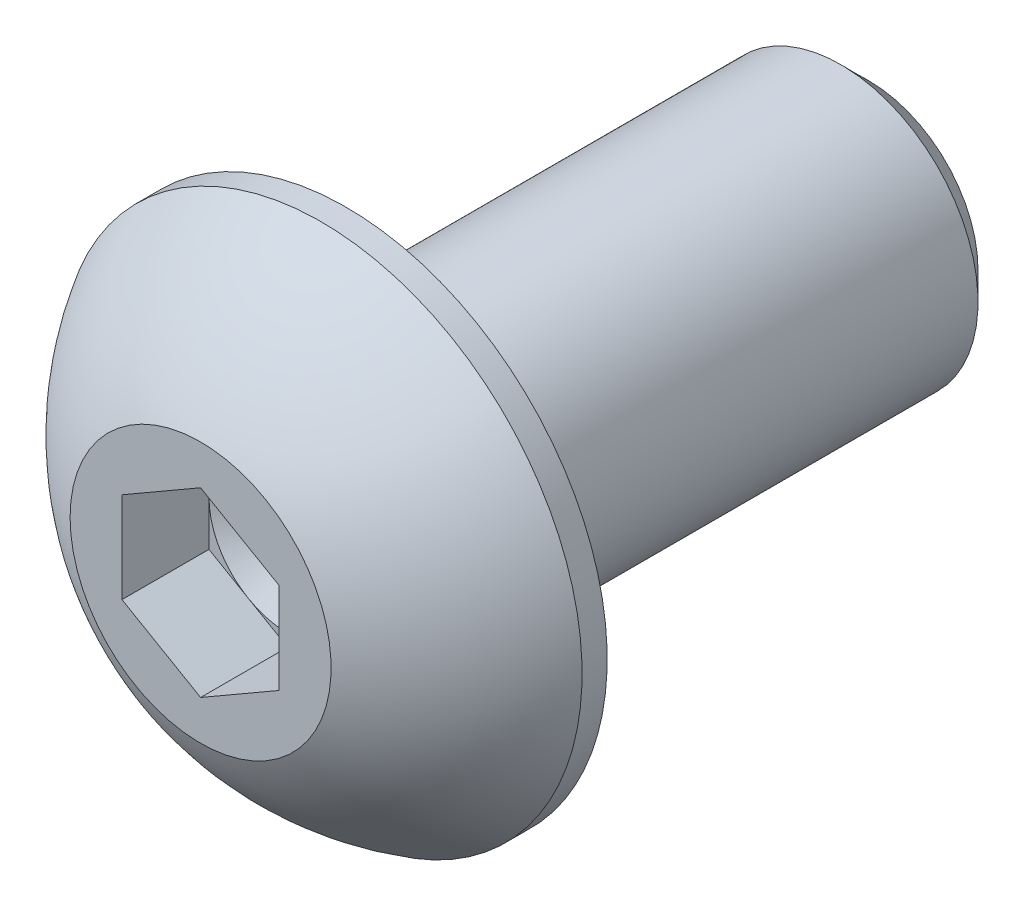
ISO-10303-21;
HEADER;
FILE_DESCRIPTION(('STEP AP214'),'2;1');
FILE_NAME('part.step','',(''),(''),'','','');
FILE_SCHEMA(('AUTOMOTIVE_DESIGN { 1 0 10303 214 1 1 1 1 }'));
ENDSEC;
DATA;
#1=APPLICATION_CONTEXT('core data for automotive mechanical design processes');
#2=APPLICATION_PROTOCOL_DEFINITION('international standard','automotive_design',2000,#1);
#3=PRODUCT_CONTEXT('',#1,'mechanical');
#4=PRODUCT('Part','Part','',(#3));
#5=PRODUCT_RELATED_PRODUCT_CATEGORY('part','',(#4));
#6=PRODUCT_DEFINITION_FORMATION('','',#4);
#7=PRODUCT_DEFINITION_CONTEXT('part definition',#1,'design');
#8=PRODUCT_DEFINITION('design','',#6,#7);
#9=PRODUCT_DEFINITION_SHAPE('','',#8);
#10=(LENGTH_UNIT() NAMED_UNIT(*) SI_UNIT(.MILLI.,.METRE.));
#11=(NAMED_UNIT(*) PLANE_ANGLE_UNIT() SI_UNIT($,.RADIAN.));
#12=(NAMED_UNIT(*) SI_UNIT($,.STERADIAN.) SOLID_ANGLE_UNIT());
#13=UNCERTAINTY_MEASURE_WITH_UNIT(LENGTH_MEASURE(1.E-05),#10,'distance_accuracy_value','');
#14=(GEOMETRIC_REPRESENTATION_CONTEXT(3) GLOBAL_UNCERTAINTY_ASSIGNED_CONTEXT((#13)) GLOBAL_UNIT_ASSIGNED_CONTEXT((#10,
#11,#12)) REPRESENTATION_CONTEXT('',''));
#15=CARTESIAN_POINT('',(0.,0.,0.));
#16=DIRECTION('',(0.,0.,1.));
#17=DIRECTION('',(1.,0.,0.));
#18=AXIS2_PLACEMENT_3D('',#15,#16,#17);
#19=CARTESIAN_POINT('',(0.,0.,-1.3208));
#20=DIRECTION('',(0.,0.,1.));
#21=DIRECTION('',(1.,0.,0.));
#22=AXIS2_PLACEMENT_3D('',#19,#20,#21);
#23=PLANE('',#22);
#24=CARTESIAN_POINT('',(0.,0.,-1.3208));
#25=DIRECTION('',(0.,0.,1.));
#26=DIRECTION('',(1.,0.,0.));
#27=AXIS2_PLACEMENT_3D('',#24,#25,#26);
#28=CIRCLE('',#27,1.1938);
#29=CARTESIAN_POINT('',(1.1938,0.,-1.3208));
#30=VERTEX_POINT('',#29);
#31=CARTESIAN_POINT('',(0.5969,1.03386112703786,-1.3208));
#32=VERTEX_POINT('',#31);
#33=EDGE_CURVE('E95',#30,#32,#28,.T.);
#34=ORIENTED_EDGE('',*,*,#33,.F.);
#35=DIRECTION('',(0.,-1.,0.));
#36=VECTOR('',#35,1.);
#37=CARTESIAN_POINT('',(1.1938,0.,-1.3208));
#38=LINE('',#37,#36);
#39=CARTESIAN_POINT('',(1.1938,0.689240751358576,-1.3208));
#40=VERTEX_POINT('',#39);
#41=EDGE_CURVE('E117',#40,#30,#38,.T.);
#42=ORIENTED_EDGE('',*,*,#41,.F.);
#43=DIRECTION('',(0.866025403784438,-0.5,0.));
#44=VECTOR('',#43,1.);
#45=CARTESIAN_POINT('',(0.5969,1.03386112703786,-1.3208));
#46=LINE('',#45,#44);
#47=EDGE_CURVE('E115',#32,#40,#46,.T.);
#48=ORIENTED_EDGE('',*,*,#47,.F.);
#49=EDGE_LOOP('',(#34,#42,#48));
#50=FACE_BOUND('',#49,.T.);
#51=ADVANCED_FACE('F17',(#50),#23,.T.);
#52=CARTESIAN_POINT('',(-0.5969,1.03386112703786,-1.3208));
#53=VERTEX_POINT('',#52);
#54=EDGE_CURVE('E97',#32,#53,#28,.T.);
#55=ORIENTED_EDGE('',*,*,#54,.F.);
#56=CARTESIAN_POINT('',(0.,1.37848150271715,-1.3208));
#57=VERTEX_POINT('',#56);
#58=EDGE_CURVE('E111',#57,#32,#46,.T.);
#59=ORIENTED_EDGE('',*,*,#58,.F.);
#60=DIRECTION('',(0.866025403784437,0.5,0.));
#61=VECTOR('',#60,1.);
#62=CARTESIAN_POINT('',(-0.5969,1.03386112703786,-1.3208));
#63=LINE('',#62,#61);
#64=EDGE_CURVE('E112',#53,#57,#63,.T.);
#65=ORIENTED_EDGE('',*,*,#64,.F.);
#66=EDGE_LOOP('',(#55,#59,#65));
#67=FACE_BOUND('',#66,.T.);
#68=ADVANCED_FACE('F109',(#67),#23,.T.);
#69=CARTESIAN_POINT('',(-1.1938,0.,-1.3208));
#70=VERTEX_POINT('',#69);
#71=EDGE_CURVE('E114',#53,#70,#28,.T.);
#72=ORIENTED_EDGE('',*,*,#71,.F.);
#73=CARTESIAN_POINT('',(-1.1938,0.689240751358572,-1.3208));
#74=VERTEX_POINT('',#73);
#75=EDGE_CURVE('E126',#74,#53,#63,.T.);
#76=ORIENTED_EDGE('',*,*,#75,.F.);
#77=DIRECTION('',(0.,1.,0.));
#78=VECTOR('',#77,1.);
#79=CARTESIAN_POINT('',(-1.1938,0.,-1.3208));
#80=LINE('',#79,#78);
#81=EDGE_CURVE('E129',#70,#74,#80,.T.);
#82=ORIENTED_EDGE('',*,*,#81,.F.);
#83=EDGE_LOOP('',(#72,#76,#82));
#84=FACE_BOUND('',#83,.T.);
#85=ADVANCED_FACE('F198',(#84),#23,.T.);
#86=CARTESIAN_POINT('',(-0.5969,-1.03386112703786,-1.3208));
#87=VERTEX_POINT('',#86);
#88=EDGE_CURVE('E224',#70,#87,#28,.T.);
#89=ORIENTED_EDGE('',*,*,#88,.F.);
#90=CARTESIAN_POINT('',(-1.1938,-0.689240751358575,-1.3208));
#91=VERTEX_POINT('',#90);
#92=EDGE_CURVE('E130',#91,#70,#80,.T.);
#93=ORIENTED_EDGE('',*,*,#92,.F.);
#94=DIRECTION('',(-0.866025403784438,0.5,0.));
#95=VECTOR('',#94,1.);
#96=CARTESIAN_POINT('',(-0.5969,-1.03386112703786,-1.3208));
#97=LINE('',#96,#95);
#98=EDGE_CURVE('E133',#87,#91,#97,.T.);
#99=ORIENTED_EDGE('',*,*,#98,.F.);
#100=EDGE_LOOP('',(#89,#93,#99));
#101=FACE_BOUND('',#100,.T.);
#102=ADVANCED_FACE('F211',(#101),#23,.T.);
#103=CARTESIAN_POINT('',(0.5969,-1.03386112703786,-1.3208));
#104=VERTEX_POINT('',#103);
#105=EDGE_CURVE('E32',#87,#104,#28,.T.);
#106=ORIENTED_EDGE('',*,*,#105,.F.);
#107=CARTESIAN_POINT('',(0.,-1.37848150271715,-1.3208));
#108=VERTEX_POINT('',#107);
#109=EDGE_CURVE('E134',#108,#87,#97,.T.);
#110=ORIENTED_EDGE('',*,*,#109,.F.);
#111=DIRECTION('',(-0.866025403784437,-0.5,0.));
#112=VECTOR('',#111,1.);
#113=CARTESIAN_POINT('',(0.5969,-1.03386112703786,-1.3208));
#114=LINE('',#113,#112);
#115=EDGE_CURVE('E137',#104,#108,#114,.T.);
#116=ORIENTED_EDGE('',*,*,#115,.F.);
#117=EDGE_LOOP('',(#106,#110,#116));
#118=FACE_BOUND('',#117,.T.);
#119=ADVANCED_FACE('F203',(#118),#23,.T.);
#120=CARTESIAN_POINT('',(-0.9906,0.,0.));
#121=DIRECTION('',(0.,0.,1.));
#122=DIRECTION('',(1.,0.,0.));
#123=AXIS2_PLACEMENT_3D('',#120,#121,#122);
#124=PLANE('',#123);
#125=CARTESIAN_POINT('',(0.,0.,0.));
#126=DIRECTION('',(0.,0.,-1.));
#127=DIRECTION('',(-1.,0.,0.));
#128=AXIS2_PLACEMENT_3D('',#125,#126,#127);
#129=CIRCLE('',#128,1.9812);
#130=CARTESIAN_POINT('',(-1.9812,0.,0.));
#131=VERTEX_POINT('',#130);
#132=EDGE_CURVE('E171',#131,#131,#129,.T.);
#133=ORIENTED_EDGE('',*,*,#132,.F.);
#134=EDGE_LOOP('',(#133));
#135=FACE_BOUND('',#134,.T.);
#136=DIRECTION('',(0.866025403784437,0.5,0.));
#137=VECTOR('',#136,1.);
#138=CARTESIAN_POINT('',(-0.5969,1.03386112703786,0.));
#139=LINE('',#138,#137);
#140=CARTESIAN_POINT('',(-1.1938,0.689240751358572,0.));
#141=VERTEX_POINT('',#140);
#142=CARTESIAN_POINT('',(0.,1.37848150271715,0.));
#143=VERTEX_POINT('',#142);
#144=EDGE_CURVE('E146',#141,#143,#139,.T.);
#145=ORIENTED_EDGE('',*,*,#144,.T.);
#146=DIRECTION('',(0.866025403784438,-0.5,0.));
#147=VECTOR('',#146,1.);
#148=CARTESIAN_POINT('',(0.5969,1.03386112703786,0.));
#149=LINE('',#148,#147);
#150=CARTESIAN_POINT('',(1.1938,0.689240751358576,0.));
#151=VERTEX_POINT('',#150);
#152=EDGE_CURVE('E104',#143,#151,#149,.T.);
#153=ORIENTED_EDGE('',*,*,#152,.T.);
#154=DIRECTION('',(0.,-1.,0.));
#155=VECTOR('',#154,1.);
#156=CARTESIAN_POINT('',(1.1938,0.,0.));
#157=LINE('',#156,#155);
#158=CARTESIAN_POINT('',(1.1938,-0.689240751358576,0.));
#159=VERTEX_POINT('',#158);
#160=EDGE_CURVE('E120',#151,#159,#157,.T.);
#161=ORIENTED_EDGE('',*,*,#160,.T.);
#162=DIRECTION('',(-0.866025403784437,-0.5,0.));
#163=VECTOR('',#162,1.);
#164=CARTESIAN_POINT('',(0.5969,-1.03386112703786,0.));
#165=LINE('',#164,#163);
#166=CARTESIAN_POINT('',(0.,-1.37848150271715,0.));
#167=VERTEX_POINT('',#166);
#168=EDGE_CURVE('E40',#159,#167,#165,.T.);
#169=ORIENTED_EDGE('',*,*,#168,.T.);
#170=DIRECTION('',(-0.866025403784438,0.5,0.));
#171=VECTOR('',#170,1.);
#172=CARTESIAN_POINT('',(-0.5969,-1.03386112703786,0.));
#173=LINE('',#172,#171);
#174=CARTESIAN_POINT('',(-1.1938,-0.689240751358575,0.));
#175=VERTEX_POINT('',#174);
#176=EDGE_CURVE('E152',#167,#175,#173,.T.);
#177=ORIENTED_EDGE('',*,*,#176,.T.);
#178=DIRECTION('',(0.,1.,0.));
#179=VECTOR('',#178,1.);
#180=CARTESIAN_POINT('',(-1.1938,0.,0.));
#181=LINE('',#180,#179);
#182=EDGE_CURVE('E149',#175,#141,#181,.T.);
#183=ORIENTED_EDGE('',*,*,#182,.T.);
#184=EDGE_LOOP('',(#145,#153,#161,#169,#177,#183));
#185=FACE_BOUND('',#184,.T.);
#186=ADVANCED_FACE('F210',(#135,#185),#124,.T.);
#187=CARTESIAN_POINT('',(0.,0.,1.48381805047393));
#188=DIRECTION('',(0.,0.,-1.));
#189=DIRECTION('',(-1.,0.,0.));
#190=AXIS2_PLACEMENT_3D('',#187,#188,#189);
#191=CYLINDRICAL_SURFACE('',#190,3.9624);
#192=CARTESIAN_POINT('',(0.,0.,-1.8288));
#193=DIRECTION('',(0.,0.,-1.));
#194=DIRECTION('',(-1.,0.,0.));
#195=AXIS2_PLACEMENT_3D('',#192,#193,#194);
#196=CIRCLE('',#195,3.9624);
#197=CARTESIAN_POINT('',(-3.9624,0.,-1.8288));
#198=VERTEX_POINT('',#197);
#199=EDGE_CURVE('E168',#198,#198,#196,.T.);
#200=ORIENTED_EDGE('',*,*,#199,.T.);
#201=EDGE_LOOP('',(#200));
#202=FACE_BOUND('',#201,.T.);
#203=CARTESIAN_POINT('',(0.,0.,-2.2098));
#204=DIRECTION('',(0.,0.,-1.));
#205=DIRECTION('',(-1.,0.,0.));
#206=AXIS2_PLACEMENT_3D('',#203,#204,#205);
#207=CIRCLE('',#206,3.9624);
#208=CARTESIAN_POINT('',(-3.9624,0.,-2.2098));
#209=VERTEX_POINT('',#208);
#210=EDGE_CURVE('E180',#209,#209,#207,.T.);
#211=ORIENTED_EDGE('',*,*,#210,.F.);
#212=EDGE_LOOP('',(#211));
#213=FACE_BOUND('',#212,.T.);
#214=ADVANCED_FACE('F217',(#202,#213),#191,.T.);
#215=CARTESIAN_POINT('',(-3.2131,0.,-2.2098));
#216=DIRECTION('',(0.,0.,-1.));
#217=DIRECTION('',(-1.,0.,0.));
#218=AXIS2_PLACEMENT_3D('',#215,#216,#217);
#219=PLANE('',#218);
#220=ORIENTED_EDGE('',*,*,#210,.T.);
#221=EDGE_LOOP('',(#220));
#222=FACE_BOUND('',#221,.T.);
#223=CARTESIAN_POINT('',(0.,0.,-2.2098));
#224=DIRECTION('',(0.,0.,-1.));
#225=DIRECTION('',(-1.,0.,0.));
#226=AXIS2_PLACEMENT_3D('',#223,#224,#225);
#227=CIRCLE('',#226,2.4638);
#228=CARTESIAN_POINT('',(-2.4638,0.,-2.2098));
#229=VERTEX_POINT('',#228);
#230=EDGE_CURVE('E177',#229,#229,#227,.T.);
#231=ORIENTED_EDGE('',*,*,#230,.F.);
#232=EDGE_LOOP('',(#231));
#233=FACE_BOUND('',#232,.T.);
#234=ADVANCED_FACE('F270',(#222,#233),#219,.T.);
#235=CARTESIAN_POINT('',(0.,0.,-2.5908));
#236=DIRECTION('',(0.,0.,-1.));
#237=DIRECTION('',(-1.,0.,0.));
#238=AXIS2_PLACEMENT_3D('',#235,#236,#237);
#239=TOROIDAL_SURFACE('',#238,2.4638,0.381);
#240=ORIENTED_EDGE('',*,*,#230,.T.);
#241=EDGE_LOOP('',(#240));
#242=FACE_BOUND('',#241,.T.);
#243=CARTESIAN_POINT('',(0.,0.,-2.5908));
#244=DIRECTION('',(0.,0.,-1.));
#245=DIRECTION('',(-1.,0.,0.));
#246=AXIS2_PLACEMENT_3D('',#243,#244,#245);
#247=CIRCLE('',#246,2.0828);
#248=CARTESIAN_POINT('',(-2.0828,0.,-2.5908));
#249=VERTEX_POINT('',#248);
#250=EDGE_CURVE('E174',#249,#249,#247,.T.);
#251=ORIENTED_EDGE('',*,*,#250,.F.);
#252=EDGE_LOOP('',(#251));
#253=FACE_BOUND('',#252,.T.);
#254=ADVANCED_FACE('F266',(#242,#253),#239,.F.);
#255=CARTESIAN_POINT('',(0.,0.,1.48381805047393));
#256=DIRECTION('',(0.,0.,-1.));
#257=DIRECTION('',(-1.,0.,0.));
#258=AXIS2_PLACEMENT_3D('',#255,#256,#257);
#259=CYLINDRICAL_SURFACE('',#258,2.0828);
#260=CARTESIAN_POINT('',(0.,0.,-9.71835761938));
#261=DIRECTION('',(0.,0.,-1.));
#262=DIRECTION('',(-1.,0.,0.));
#263=AXIS2_PLACEMENT_3D('',#260,#261,#262);
#264=CIRCLE('',#263,2.0828);
#265=CARTESIAN_POINT('',(-2.0828,0.,-9.71835761938));
#266=VERTEX_POINT('',#265);
#267=EDGE_CURVE('E11',#266,#266,#264,.F.);
#268=ORIENTED_EDGE('',*,*,#267,.T.);
#269=EDGE_LOOP('',(#268));
#270=FACE_BOUND('',#269,.T.);
#271=ORIENTED_EDGE('',*,*,#250,.T.);
#272=EDGE_LOOP('',(#271));
#273=FACE_BOUND('',#272,.T.);
#274=ADVANCED_FACE('F263',(#270,#273),#259,.T.);
#275=CARTESIAN_POINT('',(-1.0414,0.,-10.1473));
#276=DIRECTION('',(0.,0.,-1.));
#277=DIRECTION('',(-1.,0.,0.));
#278=AXIS2_PLACEMENT_3D('',#275,#276,#277);
#279=PLANE('',#278);
#280=CARTESIAN_POINT('',(0.,0.,-10.1473));
#281=DIRECTION('',(0.,0.,-1.));
#282=DIRECTION('',(-1.,0.,0.));
#283=AXIS2_PLACEMENT_3D('',#280,#281,#282);
#284=CIRCLE('',#283,1.65385761938);
#285=CARTESIAN_POINT('',(-1.65385761938,0.,-10.1473));
#286=VERTEX_POINT('',#285);
#287=EDGE_CURVE('E25',#286,#286,#284,.T.);
#288=ORIENTED_EDGE('',*,*,#287,.T.);
#289=EDGE_LOOP('',(#288));
#290=FACE_BOUND('',#289,.T.);
#291=ADVANCED_FACE('F185',(#290),#279,.T.);
#292=CARTESIAN_POINT('',(0.,0.,-4.13385));
#293=DIRECTION('',(0.,0.,-1.));
#294=DIRECTION('',(-1.,0.,0.));
#295=AXIS2_PLACEMENT_3D('',#292,#293,#294);
#296=SPHERICAL_SURFACE('',#295,4.58408870578439);
#297=CARTESIAN_POINT('',(-3.9624,0.,-1.8288));
#298=CARTESIAN_POINT('',(-3.94806555004249,0.,-1.80415889596803));
#299=CARTESIAN_POINT('',(-3.93350118989005,0.,-1.77965153901308));
#300=CARTESIAN_POINT('',(-3.90391784301183,0.,-1.73091277312732));
#301=CARTESIAN_POINT('',(-3.88889885628605,0.,-1.70668136419653));
#302=CARTESIAN_POINT('',(-3.85841145007764,0.,-1.65850294822928));
#303=CARTESIAN_POINT('',(-3.84294303059502,0.,-1.63455594119281));
#304=CARTESIAN_POINT('',(-3.8115621515089,0.,-1.58695465816593));
#305=CARTESIAN_POINT('',(-3.79564969190541,0.,-1.56330038217551));
#306=CARTESIAN_POINT('',(-3.76338626839824,0.,-1.51629279540493));
#307=CARTESIAN_POINT('',(-3.74703530449455,0.,-1.49293948462476));
#308=CARTESIAN_POINT('',(-3.71390056387007,0.,-1.44654195584239));
#309=CARTESIAN_POINT('',(-3.69711678714927,0.,-1.42349773784017));
#310=CARTESIAN_POINT('',(-3.66312226219548,0.,-1.37772641509887));
#311=CARTESIAN_POINT('',(-3.6459115139625,0.,-1.35499931035979));
#312=CARTESIAN_POINT('',(-3.61106903611232,0.,-1.30987012412818));
#313=CARTESIAN_POINT('',(-3.59343730649512,0.,-1.28746804263567));
#314=CARTESIAN_POINT('',(-3.55775900246558,0.,-1.2429966997941));
#315=CARTESIAN_POINT('',(-3.53971242805323,0.,-1.22092743844506));
#316=CARTESIAN_POINT('',(-3.50321071542199,0.,-1.17712941694205));
#317=CARTESIAN_POINT('',(-3.48475557720311,0.,-1.15540065678809));
#318=CARTESIAN_POINT('',(-3.44744316014101,0.,-1.11229120022037));
#319=CARTESIAN_POINT('',(-3.4285858812978,0.,-1.0909105038066));
#320=CARTESIAN_POINT('',(-3.39047574613265,0.,-1.04850461612249));
#321=CARTESIAN_POINT('',(-3.37122288981071,0.,-1.02747942485214));
#322=CARTESIAN_POINT('',(-3.33232830051141,0.,-0.985791865127185));
#323=CARTESIAN_POINT('',(-3.31268656753406,0.,-0.965129496672575));
#324=CARTESIAN_POINT('',(-3.27302106109312,0.,-0.924174773973387));
#325=CARTESIAN_POINT('',(-3.25299728762955,0.,-0.903882419728808));
#326=CARTESIAN_POINT('',(-3.21257466935193,0.,-0.863674788063108));
#327=CARTESIAN_POINT('',(-3.19217582453788,0.,-0.843759510641986));
#328=CARTESIAN_POINT('',(-3.15101016323603,0.,-0.80431296399764));
#329=CARTESIAN_POINT('',(-3.13024334674824,0.,-0.784781694774417));
#330=CARTESIAN_POINT('',(-3.08834896984561,0.,-0.746109962248918));
#331=CARTESIAN_POINT('',(-3.06722140943079,0.,-0.726969498946642));
#332=CARTESIAN_POINT('',(-3.02461289797525,0.,-0.68908603996879));
#333=CARTESIAN_POINT('',(-3.00313194693455,0.,-0.670343044293214));
#334=CARTESIAN_POINT('',(-2.95982413052356,0.,-0.63326104393866));
#335=CARTESIAN_POINT('',(-2.93799726515328,0.,-0.614922039259682));
#336=CARTESIAN_POINT('',(-2.89400521677254,0.,-0.578654403661948));
#337=CARTESIAN_POINT('',(-2.87184003376209,0.,-0.560725772743191));
#338=CARTESIAN_POINT('',(-2.8271790645395,0.,-0.525285124601797));
#339=CARTESIAN_POINT('',(-2.80468327832737,0.,-0.507773107379159));
#340=CARTESIAN_POINT('',(-2.75936893220414,0.,-0.473171781566304));
#341=CARTESIAN_POINT('',(-2.73655037229303,0.,-0.456082472976087));
#342=CARTESIAN_POINT('',(-2.69059842061354,0.,-0.422332512243877));
#343=CARTESIAN_POINT('',(-2.66746502884515,0.,-0.405671860101884));
#344=CARTESIAN_POINT('',(-2.62089146486841,0.,-0.372785010889838));
#345=CARTESIAN_POINT('',(-2.59745129266007,0.,-0.356558813819785));
#346=CARTESIAN_POINT('',(-2.55027232599135,0.,-0.324546522170651));
#347=CARTESIAN_POINT('',(-2.52653353153099,0.,-0.30876042759157));
#348=CARTESIAN_POINT('',(-2.47876558248781,0.,-0.277633835152381));
#349=CARTESIAN_POINT('',(-2.454736427905,0.,-0.262293337292275));
#350=CARTESIAN_POINT('',(-2.4063961217736,0.,-0.232063277493399));
#351=CARTESIAN_POINT('',(-2.382084970225,0.,-0.21717371555463));
#352=CARTESIAN_POINT('',(-2.33318913158055,0.,-0.187850709627219));
#353=CARTESIAN_POINT('',(-2.30860444448469,0.,-0.173417265638577));
#354=CARTESIAN_POINT('',(-2.25917009093804,0.,-0.145011519744089));
#355=CARTESIAN_POINT('',(-2.23432042448725,0.,-0.131039217838244));
#356=CARTESIAN_POINT('',(-2.18436476224591,0.,-0.103560616562858));
#357=CARTESIAN_POINT('',(-2.15925876645535,0.,-0.0900543171933176));
#358=CARTESIAN_POINT('',(-2.10879917879722,0.,-0.0635124311299285));
#359=CARTESIAN_POINT('',(-2.08344558692965,0.,-0.0504768444360801));
#360=CARTESIAN_POINT('',(-2.03249964882003,0.,-0.0248808857176731));
#361=CARTESIAN_POINT('',(-2.00690730257799,0.,-0.0123205136931147));
#362=CARTESIAN_POINT('',(-1.9812,0.,0.));
#363=B_SPLINE_CURVE_WITH_KNOTS('',3,(#297,#298,#299,#300,#301,#302,#303,#304,#305,#306,#307,
#308,#309,#310,#311,#312,#313,#314,#315,#316,#317,#318,#319,#320,#321,#322,#323,#324,#325,#326,
#327,#328,#329,#330,#331,#332,#333,#334,#335,#336,#337,#338,#339,#340,#341,#342,#343,#344,#345,
#346,#347,#348,#349,#350,#351,#352,#353,#354,#355,#356,#357,#358,#359,#360,#361,#362),
.UNSPECIFIED.,.F.,.F.,(4,2,2,2,2,2,2,2,2,2,2,2,2,2,2,2,2,2,2,2,2,2,2,2,2,2,2,2,2,2,2,2,4),(0.,
0.0855203585635449,0.17104071712709,0.256561075690636,0.342081434254181,0.427601792817726,
0.513122151381271,0.598642509944817,0.684162868508362,0.769683227071907,0.855203585635452,
0.940723944198998,1.02624430276254,1.11176466132609,1.19728501988963,1.28280537845318,
1.36832573701672,1.45384609558027,1.53936645414382,1.62488681270736,1.71040717127091,
1.79592752983445,1.881447888398,1.96696824696154,2.05248860552509,2.13800896408863,
2.22352932265218,2.30904968121572,2.39457003977927,2.48009039834281,2.56561075690636,
2.6511311154699,2.73665147403345),.UNSPECIFIED.);
#364=EDGE_CURVE('BSEAM257',#198,#131,#363,.T.);
#365=ORIENTED_EDGE('',*,*,#199,.F.);
#366=ORIENTED_EDGE('',*,*,#132,.T.);
#367=ORIENTED_EDGE('',*,*,#364,.T.);
#368=ORIENTED_EDGE('',*,*,#364,.F.);
#369=EDGE_LOOP('',(#365,#367,#366,#368));
#370=FACE_BOUND('',#369,.T.);
#371=ADVANCED_FACE('F257',(#370),#296,.T.);
#372=CARTESIAN_POINT('',(0.5969,1.03386112703786,-1.3208));
#373=DIRECTION('',(-0.5,-0.866025403784439,0.));
#374=DIRECTION('',(0.866025403784438,-0.5,0.));
#375=AXIS2_PLACEMENT_3D('',#372,#373,#374);
#376=PLANE('',#375);
#377=ORIENTED_EDGE('',*,*,#152,.F.);
#378=DIRECTION('',(0.,0.,1.));
#379=VECTOR('',#378,1.);
#380=CARTESIAN_POINT('',(0.,1.37848150271715,-1.3208));
#381=LINE('',#380,#379);
#382=EDGE_CURVE('E125',#57,#143,#381,.T.);
#383=ORIENTED_EDGE('',*,*,#382,.F.);
#384=ORIENTED_EDGE('',*,*,#58,.T.);
#385=ORIENTED_EDGE('',*,*,#47,.T.);
#386=DIRECTION('',(0.,0.,1.));
#387=VECTOR('',#386,1.);
#388=CARTESIAN_POINT('',(1.1938,0.689240751358576,-1.3208));
#389=LINE('',#388,#387);
#390=EDGE_CURVE('E143',#40,#151,#389,.T.);
#391=ORIENTED_EDGE('',*,*,#390,.T.);
#392=EDGE_LOOP('',(#377,#383,#384,#385,#391));
#393=FACE_BOUND('',#392,.T.);
#394=ADVANCED_FACE('F124',(#393),#376,.T.);
#395=CARTESIAN_POINT('',(-0.5969,1.03386112703786,-1.3208));
#396=DIRECTION('',(0.5,-0.866025403784437,0.));
#397=DIRECTION('',(0.866025403784437,0.5,0.));
#398=AXIS2_PLACEMENT_3D('',#395,#396,#397);
#399=PLANE('',#398);
#400=ORIENTED_EDGE('',*,*,#144,.F.);
#401=DIRECTION('',(0.,0.,1.));
#402=VECTOR('',#401,1.);
#403=CARTESIAN_POINT('',(-1.1938,0.689240751358572,-1.3208));
#404=LINE('',#403,#402);
#405=EDGE_CURVE('E165',#74,#141,#404,.T.);
#406=ORIENTED_EDGE('',*,*,#405,.F.);
#407=ORIENTED_EDGE('',*,*,#75,.T.);
#408=ORIENTED_EDGE('',*,*,#64,.T.);
#409=ORIENTED_EDGE('',*,*,#382,.T.);
#410=EDGE_LOOP('',(#400,#406,#407,#408,#409));
#411=FACE_BOUND('',#410,.T.);
#412=ADVANCED_FACE('F240',(#411),#399,.T.);
#413=CARTESIAN_POINT('',(-1.1938,0.,-1.3208));
#414=DIRECTION('',(1.,0.,0.));
#415=DIRECTION('',(0.,0.,-1.));
#416=AXIS2_PLACEMENT_3D('',#413,#414,#415);
#417=PLANE('',#416);
#418=ORIENTED_EDGE('',*,*,#182,.F.);
#419=DIRECTION('',(0.,0.,1.));
#420=VECTOR('',#419,1.);
#421=CARTESIAN_POINT('',(-1.1938,-0.689240751358575,-1.3208));
#422=LINE('',#421,#420);
#423=EDGE_CURVE('E163',#91,#175,#422,.T.);
#424=ORIENTED_EDGE('',*,*,#423,.F.);
#425=ORIENTED_EDGE('',*,*,#92,.T.);
#426=ORIENTED_EDGE('',*,*,#81,.T.);
#427=ORIENTED_EDGE('',*,*,#405,.T.);
#428=EDGE_LOOP('',(#418,#424,#425,#426,#427));
#429=FACE_BOUND('',#428,.T.);
#430=ADVANCED_FACE('F244',(#429),#417,.T.);
#431=CARTESIAN_POINT('',(-0.5969,-1.03386112703786,-1.3208));
#432=DIRECTION('',(0.5,0.866025403784439,0.));
#433=DIRECTION('',(-0.866025403784439,0.5,0.));
#434=AXIS2_PLACEMENT_3D('',#431,#432,#433);
#435=PLANE('',#434);
#436=ORIENTED_EDGE('',*,*,#176,.F.);
#437=DIRECTION('',(0.,0.,1.));
#438=VECTOR('',#437,1.);
#439=CARTESIAN_POINT('',(0.,-1.37848150271715,-1.3208));
#440=LINE('',#439,#438);
#441=EDGE_CURVE('E161',#108,#167,#440,.T.);
#442=ORIENTED_EDGE('',*,*,#441,.F.);
#443=ORIENTED_EDGE('',*,*,#109,.T.);
#444=ORIENTED_EDGE('',*,*,#98,.T.);
#445=ORIENTED_EDGE('',*,*,#423,.T.);
#446=EDGE_LOOP('',(#436,#442,#443,#444,#445));
#447=FACE_BOUND('',#446,.T.);
#448=ADVANCED_FACE('F232',(#447),#435,.T.);
#449=CARTESIAN_POINT('',(0.5969,-1.03386112703786,-1.3208));
#450=DIRECTION('',(-0.5,0.866025403784437,0.));
#451=DIRECTION('',(-0.866025403784437,-0.5,0.));
#452=AXIS2_PLACEMENT_3D('',#449,#450,#451);
#453=PLANE('',#452);
#454=ORIENTED_EDGE('',*,*,#168,.F.);
#455=DIRECTION('',(0.,0.,1.));
#456=VECTOR('',#455,1.);
#457=CARTESIAN_POINT('',(1.1938,-0.689240751358576,-1.3208));
#458=LINE('',#457,#456);
#459=CARTESIAN_POINT('',(1.1938,-0.689240751358576,-1.3208));
#460=VERTEX_POINT('',#459);
#461=EDGE_CURVE('E159',#460,#159,#458,.T.);
#462=ORIENTED_EDGE('',*,*,#461,.F.);
#463=EDGE_CURVE('E138',#460,#104,#114,.T.);
#464=ORIENTED_EDGE('',*,*,#463,.T.);
#465=ORIENTED_EDGE('',*,*,#115,.T.);
#466=ORIENTED_EDGE('',*,*,#441,.T.);
#467=EDGE_LOOP('',(#454,#462,#464,#465,#466));
#468=FACE_BOUND('',#467,.T.);
#469=ADVANCED_FACE('F207',(#468),#453,.T.);
#470=CARTESIAN_POINT('',(1.1938,0.,-1.3208));
#471=DIRECTION('',(-1.,0.,0.));
#472=DIRECTION('',(0.,0.,1.));
#473=AXIS2_PLACEMENT_3D('',#470,#471,#472);
#474=PLANE('',#473);
#475=ORIENTED_EDGE('',*,*,#160,.F.);
#476=ORIENTED_EDGE('',*,*,#390,.F.);
#477=ORIENTED_EDGE('',*,*,#41,.T.);
#478=EDGE_CURVE('E141',#30,#460,#38,.T.);
#479=ORIENTED_EDGE('',*,*,#478,.T.);
#480=ORIENTED_EDGE('',*,*,#461,.T.);
#481=EDGE_LOOP('',(#475,#476,#477,#479,#480));
#482=FACE_BOUND('',#481,.T.);
#483=ADVANCED_FACE('F201',(#482),#474,.T.);
#484=EDGE_CURVE('E99',#104,#30,#28,.T.);
#485=ORIENTED_EDGE('',*,*,#484,.F.);
#486=ORIENTED_EDGE('',*,*,#463,.F.);
#487=ORIENTED_EDGE('',*,*,#478,.F.);
#488=EDGE_LOOP('',(#485,#486,#487));
#489=FACE_BOUND('',#488,.T.);
#490=ADVANCED_FACE('F92',(#489),#23,.T.);
#491=CARTESIAN_POINT('',(0.,0.,-1.3208));
#492=DIRECTION('',(0.,0.,1.));
#493=DIRECTION('',(1.,0.,0.));
#494=AXIS2_PLACEMENT_3D('',#491,#492,#493);
#495=CONICAL_SURFACE('',#494,1.1938,1.0471975511966);
#496=CARTESIAN_POINT('',(0.,0.,-2.01004075135857));
#497=VERTEX_POINT('',#496);
#498=VERTEX_LOOP('',#497);
#499=FACE_BOUND('',#498,.T.);
#500=ORIENTED_EDGE('',*,*,#33,.T.);
#501=ORIENTED_EDGE('',*,*,#54,.T.);
#502=ORIENTED_EDGE('',*,*,#71,.T.);
#503=ORIENTED_EDGE('',*,*,#88,.T.);
#504=ORIENTED_EDGE('',*,*,#105,.T.);
#505=ORIENTED_EDGE('',*,*,#484,.T.);
#506=EDGE_LOOP('',(#500,#501,#502,#503,#504,#505));
#507=FACE_BOUND('',#506,.T.);
#508=ADVANCED_FACE('F90',(#499,#507),#495,.F.);
#509=CARTESIAN_POINT('',(0.,0.,-10.1473));
#510=DIRECTION('',(0.,0.,1.));
#511=DIRECTION('',(1.,0.,0.));
#512=AXIS2_PLACEMENT_3D('',#509,#510,#511);
#513=CONICAL_SURFACE('',#512,1.65385761938,0.785398163397448);
#514=ORIENTED_EDGE('',*,*,#267,.F.);
#515=EDGE_LOOP('',(#514));
#516=FACE_BOUND('',#515,.T.);
#517=ORIENTED_EDGE('',*,*,#287,.F.);
#518=EDGE_LOOP('',(#517));
#519=FACE_BOUND('',#518,.T.);
#520=ADVANCED_FACE('F19',(#516,#519),#513,.T.);
#521=CLOSED_SHELL('',(#51,#68,#85,#102,#119,#186,#214,#234,#254,#274,#291,#371,#394,#412,#430,
#448,#469,#483,#490,#508,#520));
#522=MANIFOLD_SOLID_BREP('B1',#521);
#523=ADVANCED_BREP_SHAPE_REPRESENTATION('',(#18,#522),#14);
#524=SHAPE_DEFINITION_REPRESENTATION(#9,#523);
ENDSEC;
END-ISO-10303-21;
